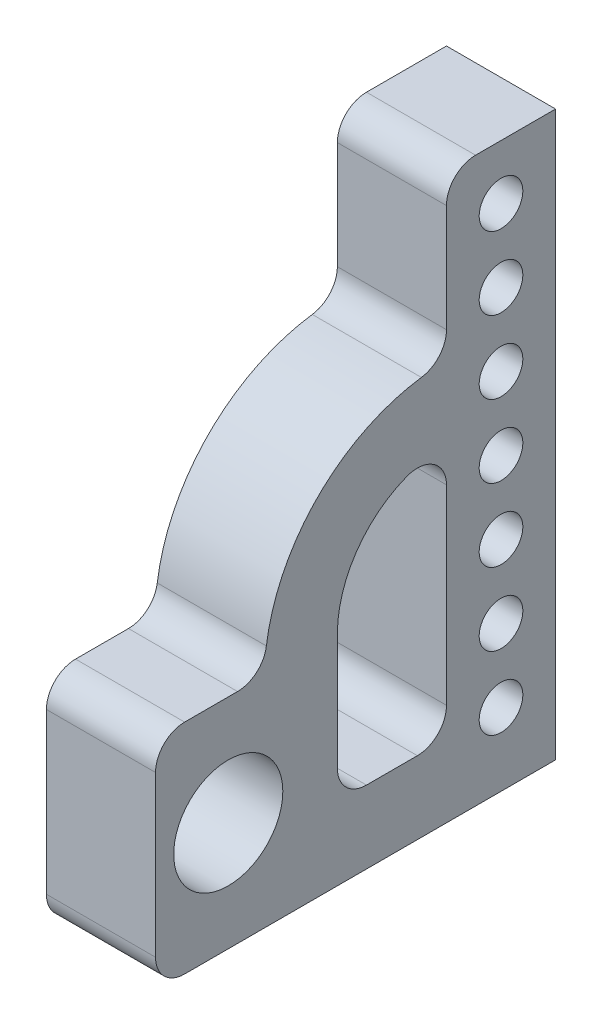
ISO-10303-21;
HEADER;
FILE_DESCRIPTION(('STEP AP214'),'2;1');
FILE_NAME('part.step','',(''),(''),'','','');
FILE_SCHEMA(('AUTOMOTIVE_DESIGN { 1 0 10303 214 1 1 1 1 }'));
ENDSEC;
DATA;
#1=APPLICATION_CONTEXT('core data for automotive mechanical design processes');
#2=APPLICATION_PROTOCOL_DEFINITION('international standard','automotive_design',2000,#1);
#3=PRODUCT_CONTEXT('',#1,'mechanical');
#4=PRODUCT('Part','Part','',(#3));
#5=PRODUCT_RELATED_PRODUCT_CATEGORY('part','',(#4));
#6=PRODUCT_DEFINITION_FORMATION('','',#4);
#7=PRODUCT_DEFINITION_CONTEXT('part definition',#1,'design');
#8=PRODUCT_DEFINITION('design','',#6,#7);
#9=PRODUCT_DEFINITION_SHAPE('','',#8);
#10=(LENGTH_UNIT() NAMED_UNIT(*) SI_UNIT(.MILLI.,.METRE.));
#11=(NAMED_UNIT(*) PLANE_ANGLE_UNIT() SI_UNIT($,.RADIAN.));
#12=(NAMED_UNIT(*) SI_UNIT($,.STERADIAN.) SOLID_ANGLE_UNIT());
#13=UNCERTAINTY_MEASURE_WITH_UNIT(LENGTH_MEASURE(1.E-05),#10,'distance_accuracy_value','');
#14=(GEOMETRIC_REPRESENTATION_CONTEXT(3) GLOBAL_UNCERTAINTY_ASSIGNED_CONTEXT((#13)) GLOBAL_UNIT_ASSIGNED_CONTEXT((#10,
#11,#12)) REPRESENTATION_CONTEXT('',''));
#15=CARTESIAN_POINT('',(0.,0.,0.));
#16=DIRECTION('',(0.,0.,1.));
#17=DIRECTION('',(1.,0.,0.));
#18=AXIS2_PLACEMENT_3D('',#15,#16,#17);
#19=CARTESIAN_POINT('',(30.,0.,0.));
#20=DIRECTION('',(1.,0.,0.));
#21=DIRECTION('',(0.,0.,-1.));
#22=AXIS2_PLACEMENT_3D('',#19,#20,#21);
#23=PLANE('',#22);
#24=DIRECTION('',(0.,0.,1.));
#25=VECTOR('',#24,1.);
#26=CARTESIAN_POINT('',(30.,20.,0.));
#27=LINE('',#26,#25);
#28=CARTESIAN_POINT('',(30.,20.,38.));
#29=VERTEX_POINT('',#28);
#30=CARTESIAN_POINT('',(30.,20.,52.));
#31=VERTEX_POINT('',#30);
#32=EDGE_CURVE('E238',#29,#31,#27,.T.);
#33=ORIENTED_EDGE('',*,*,#32,.T.);
#34=CARTESIAN_POINT('',(30.,28.,52.));
#35=DIRECTION('',(1.,0.,0.));
#36=DIRECTION('',(0.,0.,-1.));
#37=AXIS2_PLACEMENT_3D('',#34,#35,#36);
#38=CIRCLE('',#37,8.);
#39=CARTESIAN_POINT('',(30.,28.,60.));
#40=VERTEX_POINT('',#39);
#41=EDGE_CURVE('E351',#31,#40,#38,.F.);
#42=ORIENTED_EDGE('',*,*,#41,.T.);
#43=DIRECTION('',(0.,1.,0.));
#44=VECTOR('',#43,1.);
#45=CARTESIAN_POINT('',(30.,0.,60.));
#46=LINE('',#45,#44);
#47=CARTESIAN_POINT('',(30.,60.,60.));
#48=VERTEX_POINT('',#47);
#49=EDGE_CURVE('E230',#40,#48,#46,.T.);
#50=ORIENTED_EDGE('',*,*,#49,.T.);
#51=CARTESIAN_POINT('',(30.,60.,30.));
#52=DIRECTION('',(1.,0.,0.));
#53=DIRECTION('',(0.,0.,-1.));
#54=AXIS2_PLACEMENT_3D('',#51,#52,#53);
#55=CIRCLE('',#54,30.);
#56=CARTESIAN_POINT('',(30.,87.946229361708,40.9090909090909));
#57=VERTEX_POINT('',#56);
#58=EDGE_CURVE('E232',#48,#57,#55,.F.);
#59=ORIENTED_EDGE('',*,*,#58,.T.);
#60=CARTESIAN_POINT('',(30.,80.4939015319192,38.));
#61=DIRECTION('',(1.,0.,0.));
#62=DIRECTION('',(0.,0.,-1.));
#63=AXIS2_PLACEMENT_3D('',#60,#61,#62);
#64=CIRCLE('',#63,8.);
#65=CARTESIAN_POINT('',(30.,80.4939015319192,30.));
#66=VERTEX_POINT('',#65);
#67=EDGE_CURVE('E347',#57,#66,#64,.F.);
#68=ORIENTED_EDGE('',*,*,#67,.T.);
#69=DIRECTION('',(0.,-1.,0.));
#70=VECTOR('',#69,1.);
#71=CARTESIAN_POINT('',(30.,0.,30.));
#72=LINE('',#71,#70);
#73=CARTESIAN_POINT('',(30.,28.,30.));
#74=VERTEX_POINT('',#73);
#75=EDGE_CURVE('E235',#66,#74,#72,.T.);
#76=ORIENTED_EDGE('',*,*,#75,.T.);
#77=CARTESIAN_POINT('',(30.,28.,38.));
#78=DIRECTION('',(1.,0.,0.));
#79=DIRECTION('',(0.,0.,-1.));
#80=AXIS2_PLACEMENT_3D('',#77,#78,#79);
#81=CIRCLE('',#80,8.);
#82=EDGE_CURVE('E355',#74,#29,#81,.F.);
#83=ORIENTED_EDGE('',*,*,#82,.T.);
#84=EDGE_LOOP('',(#33,#42,#50,#59,#68,#76,#83));
#85=FACE_BOUND('',#84,.T.);
#86=DIRECTION('',(0.,0.,1.));
#87=VECTOR('',#86,1.);
#88=CARTESIAN_POINT('',(30.,155.,0.));
#89=LINE('',#88,#87);
#90=CARTESIAN_POINT('',(30.,155.,0.));
#91=VERTEX_POINT('',#90);
#92=CARTESIAN_POINT('',(30.,155.,22.));
#93=VERTEX_POINT('',#92);
#94=EDGE_CURVE('E217',#91,#93,#89,.T.);
#95=ORIENTED_EDGE('',*,*,#94,.T.);
#96=CARTESIAN_POINT('',(30.,147.,22.));
#97=DIRECTION('',(1.,0.,0.));
#98=DIRECTION('',(0.,0.,-1.));
#99=AXIS2_PLACEMENT_3D('',#96,#97,#98);
#100=CIRCLE('',#99,8.);
#101=CARTESIAN_POINT('',(30.,147.,30.));
#102=VERTEX_POINT('',#101);
#103=EDGE_CURVE('E326',#93,#102,#100,.T.);
#104=ORIENTED_EDGE('',*,*,#103,.T.);
#105=DIRECTION('',(0.,-1.,0.));
#106=VECTOR('',#105,1.);
#107=CARTESIAN_POINT('',(30.,0.,30.));
#108=LINE('',#107,#106);
#109=CARTESIAN_POINT('',(30.,117.44562646538,30.));
#110=VERTEX_POINT('',#109);
#111=EDGE_CURVE('E227',#102,#110,#108,.T.);
#112=ORIENTED_EDGE('',*,*,#111,.T.);
#113=CARTESIAN_POINT('',(30.,117.44562646538,38.));
#114=DIRECTION('',(1.,0.,0.));
#115=DIRECTION('',(0.,0.,-1.));
#116=AXIS2_PLACEMENT_3D('',#113,#114,#115);
#117=CIRCLE('',#116,8.);
#118=CARTESIAN_POINT('',(30.,109.5220917805,36.8965517241379));
#119=VERTEX_POINT('',#118);
#120=EDGE_CURVE('E359',#110,#119,#117,.F.);
#121=ORIENTED_EDGE('',*,*,#120,.T.);
#122=CARTESIAN_POINT('',(30.,60.,30.));
#123=DIRECTION('',(1.,0.,0.));
#124=DIRECTION('',(0.,0.,-1.));
#125=AXIS2_PLACEMENT_3D('',#122,#123,#124);
#126=CIRCLE('',#125,50.);
#127=CARTESIAN_POINT('',(30.,66.8965517241379,79.5220917805002));
#128=VERTEX_POINT('',#127);
#129=EDGE_CURVE('E377',#128,#119,#126,.F.);
#130=ORIENTED_EDGE('',*,*,#129,.F.);
#131=CARTESIAN_POINT('',(30.,68.,87.4456264653803));
#132=DIRECTION('',(1.,0.,0.));
#133=DIRECTION('',(0.,0.,-1.));
#134=AXIS2_PLACEMENT_3D('',#131,#132,#133);
#135=CIRCLE('',#134,8.);
#136=CARTESIAN_POINT('',(30.,60.,87.4456264653803));
#137=VERTEX_POINT('',#136);
#138=EDGE_CURVE('E12',#128,#137,#135,.F.);
#139=ORIENTED_EDGE('',*,*,#138,.T.);
#140=DIRECTION('',(0.,0.,-1.));
#141=VECTOR('',#140,1.);
#142=CARTESIAN_POINT('',(30.,60.,0.));
#143=LINE('',#142,#141);
#144=CARTESIAN_POINT('',(30.,60.,102.));
#145=VERTEX_POINT('',#144);
#146=EDGE_CURVE('E222',#145,#137,#143,.T.);
#147=ORIENTED_EDGE('',*,*,#146,.F.);
#148=CARTESIAN_POINT('',(30.,52.,102.));
#149=DIRECTION('',(1.,0.,0.));
#150=DIRECTION('',(0.,0.,-1.));
#151=AXIS2_PLACEMENT_3D('',#148,#149,#150);
#152=CIRCLE('',#151,8.);
#153=CARTESIAN_POINT('',(30.,52.,110.));
#154=VERTEX_POINT('',#153);
#155=EDGE_CURVE('E87',#145,#154,#152,.T.);
#156=ORIENTED_EDGE('',*,*,#155,.T.);
#157=DIRECTION('',(0.,1.,0.));
#158=VECTOR('',#157,1.);
#159=CARTESIAN_POINT('',(30.,0.,110.));
#160=LINE('',#159,#158);
#161=CARTESIAN_POINT('',(30.,8.,110.));
#162=VERTEX_POINT('',#161);
#163=EDGE_CURVE('E220',#162,#154,#160,.T.);
#164=ORIENTED_EDGE('',*,*,#163,.F.);
#165=CARTESIAN_POINT('',(30.,8.,102.));
#166=DIRECTION('',(1.,0.,0.));
#167=DIRECTION('',(0.,0.,-1.));
#168=AXIS2_PLACEMENT_3D('',#165,#166,#167);
#169=CIRCLE('',#168,8.);
#170=CARTESIAN_POINT('',(30.,0.,102.));
#171=VERTEX_POINT('',#170);
#172=EDGE_CURVE('E81',#162,#171,#169,.T.);
#173=ORIENTED_EDGE('',*,*,#172,.T.);
#174=DIRECTION('',(0.,0.,1.));
#175=VECTOR('',#174,1.);
#176=CARTESIAN_POINT('',(30.,0.,0.));
#177=LINE('',#176,#175);
#178=CARTESIAN_POINT('',(30.,0.,0.));
#179=VERTEX_POINT('',#178);
#180=EDGE_CURVE('E201',#179,#171,#177,.T.);
#181=ORIENTED_EDGE('',*,*,#180,.F.);
#182=DIRECTION('',(0.,1.,0.));
#183=VECTOR('',#182,1.);
#184=CARTESIAN_POINT('',(30.,0.,0.));
#185=LINE('',#184,#183);
#186=EDGE_CURVE('E213',#179,#91,#185,.T.);
#187=ORIENTED_EDGE('',*,*,#186,.T.);
#188=EDGE_LOOP('',(#95,#104,#112,#121,#130,#139,#147,#156,#164,#173,#181,#187));
#189=FACE_BOUND('',#188,.T.);
#190=CARTESIAN_POINT('',(30.,20.,15.));
#191=DIRECTION('',(1.,0.,0.));
#192=DIRECTION('',(0.,0.,-1.));
#193=AXIS2_PLACEMENT_3D('',#190,#191,#192);
#194=CIRCLE('',#193,6.);
#195=CARTESIAN_POINT('',(30.,20.,9.));
#196=VERTEX_POINT('',#195);
#197=EDGE_CURVE('E381',#196,#196,#194,.T.);
#198=ORIENTED_EDGE('',*,*,#197,.F.);
#199=EDGE_LOOP('',(#198));
#200=FACE_BOUND('',#199,.T.);
#201=CARTESIAN_POINT('',(30.,40.,15.));
#202=DIRECTION('',(1.,0.,0.));
#203=DIRECTION('',(0.,0.,-1.));
#204=AXIS2_PLACEMENT_3D('',#201,#202,#203);
#205=CIRCLE('',#204,6.);
#206=CARTESIAN_POINT('',(30.,40.,9.));
#207=VERTEX_POINT('',#206);
#208=EDGE_CURVE('E386',#207,#207,#205,.T.);
#209=ORIENTED_EDGE('',*,*,#208,.F.);
#210=EDGE_LOOP('',(#209));
#211=FACE_BOUND('',#210,.T.);
#212=CARTESIAN_POINT('',(30.,60.,15.));
#213=DIRECTION('',(1.,0.,0.));
#214=DIRECTION('',(0.,0.,-1.));
#215=AXIS2_PLACEMENT_3D('',#212,#213,#214);
#216=CIRCLE('',#215,6.);
#217=CARTESIAN_POINT('',(30.,60.,9.));
#218=VERTEX_POINT('',#217);
#219=EDGE_CURVE('E389',#218,#218,#216,.T.);
#220=ORIENTED_EDGE('',*,*,#219,.F.);
#221=EDGE_LOOP('',(#220));
#222=FACE_BOUND('',#221,.T.);
#223=CARTESIAN_POINT('',(30.,80.,15.));
#224=DIRECTION('',(1.,0.,0.));
#225=DIRECTION('',(0.,0.,-1.));
#226=AXIS2_PLACEMENT_3D('',#223,#224,#225);
#227=CIRCLE('',#226,6.);
#228=CARTESIAN_POINT('',(30.,80.,9.));
#229=VERTEX_POINT('',#228);
#230=EDGE_CURVE('E392',#229,#229,#227,.T.);
#231=ORIENTED_EDGE('',*,*,#230,.F.);
#232=EDGE_LOOP('',(#231));
#233=FACE_BOUND('',#232,.T.);
#234=CARTESIAN_POINT('',(30.,100.,15.));
#235=DIRECTION('',(1.,0.,0.));
#236=DIRECTION('',(0.,0.,-1.));
#237=AXIS2_PLACEMENT_3D('',#234,#235,#236);
#238=CIRCLE('',#237,6.);
#239=CARTESIAN_POINT('',(30.,100.,9.));
#240=VERTEX_POINT('',#239);
#241=EDGE_CURVE('E395',#240,#240,#238,.T.);
#242=ORIENTED_EDGE('',*,*,#241,.F.);
#243=EDGE_LOOP('',(#242));
#244=FACE_BOUND('',#243,.T.);
#245=CARTESIAN_POINT('',(30.,120.,15.));
#246=DIRECTION('',(1.,0.,0.));
#247=DIRECTION('',(0.,0.,-1.));
#248=AXIS2_PLACEMENT_3D('',#245,#246,#247);
#249=CIRCLE('',#248,6.00000000000002);
#250=CARTESIAN_POINT('',(30.,120.,8.99999999999998));
#251=VERTEX_POINT('',#250);
#252=EDGE_CURVE('E398',#251,#251,#249,.T.);
#253=ORIENTED_EDGE('',*,*,#252,.F.);
#254=EDGE_LOOP('',(#253));
#255=FACE_BOUND('',#254,.T.);
#256=CARTESIAN_POINT('',(30.,140.,15.));
#257=DIRECTION('',(1.,0.,0.));
#258=DIRECTION('',(0.,0.,-1.));
#259=AXIS2_PLACEMENT_3D('',#256,#257,#258);
#260=CIRCLE('',#259,6.00000000000002);
#261=CARTESIAN_POINT('',(30.,140.,8.99999999999998));
#262=VERTEX_POINT('',#261);
#263=EDGE_CURVE('E292',#262,#262,#260,.T.);
#264=ORIENTED_EDGE('',*,*,#263,.F.);
#265=EDGE_LOOP('',(#264));
#266=FACE_BOUND('',#265,.T.);
#267=CARTESIAN_POINT('',(30.,30.,90.));
#268=DIRECTION('',(1.,0.,0.));
#269=DIRECTION('',(0.,0.,-1.));
#270=AXIS2_PLACEMENT_3D('',#267,#268,#269);
#271=CIRCLE('',#270,15.);
#272=CARTESIAN_POINT('',(30.,30.,75.));
#273=VERTEX_POINT('',#272);
#274=EDGE_CURVE('E245',#273,#273,#271,.T.);
#275=ORIENTED_EDGE('',*,*,#274,.F.);
#276=EDGE_LOOP('',(#275));
#277=FACE_BOUND('',#276,.T.);
#278=ADVANCED_FACE('F66',(#85,#189,#200,#211,#222,#233,#244,#255,#266,#277),#23,.T.);
#279=CARTESIAN_POINT('',(0.,0.,0.));
#280=DIRECTION('',(1.,0.,0.));
#281=DIRECTION('',(0.,0.,-1.));
#282=AXIS2_PLACEMENT_3D('',#279,#280,#281);
#283=PLANE('',#282);
#284=CARTESIAN_POINT('',(0.,140.,15.));
#285=DIRECTION('',(1.,0.,0.));
#286=DIRECTION('',(0.,0.,-1.));
#287=AXIS2_PLACEMENT_3D('',#284,#285,#286);
#288=CIRCLE('',#287,6.00000000000002);
#289=CARTESIAN_POINT('',(0.,140.,8.99999999999998));
#290=VERTEX_POINT('',#289);
#291=EDGE_CURVE('E241',#290,#290,#288,.T.);
#292=ORIENTED_EDGE('',*,*,#291,.T.);
#293=EDGE_LOOP('',(#292));
#294=FACE_BOUND('',#293,.T.);
#295=CARTESIAN_POINT('',(0.,120.,15.));
#296=DIRECTION('',(1.,0.,0.));
#297=DIRECTION('',(0.,0.,-1.));
#298=AXIS2_PLACEMENT_3D('',#295,#296,#297);
#299=CIRCLE('',#298,6.00000000000002);
#300=CARTESIAN_POINT('',(0.,120.,8.99999999999998));
#301=VERTEX_POINT('',#300);
#302=EDGE_CURVE('E244',#301,#301,#299,.T.);
#303=ORIENTED_EDGE('',*,*,#302,.T.);
#304=EDGE_LOOP('',(#303));
#305=FACE_BOUND('',#304,.T.);
#306=CARTESIAN_POINT('',(0.,100.,15.));
#307=DIRECTION('',(1.,0.,0.));
#308=DIRECTION('',(0.,0.,-1.));
#309=AXIS2_PLACEMENT_3D('',#306,#307,#308);
#310=CIRCLE('',#309,6.);
#311=CARTESIAN_POINT('',(0.,100.,9.));
#312=VERTEX_POINT('',#311);
#313=EDGE_CURVE('E248',#312,#312,#310,.T.);
#314=ORIENTED_EDGE('',*,*,#313,.T.);
#315=EDGE_LOOP('',(#314));
#316=FACE_BOUND('',#315,.T.);
#317=CARTESIAN_POINT('',(0.,80.,15.));
#318=DIRECTION('',(1.,0.,0.));
#319=DIRECTION('',(0.,0.,-1.));
#320=AXIS2_PLACEMENT_3D('',#317,#318,#319);
#321=CIRCLE('',#320,6.);
#322=CARTESIAN_POINT('',(0.,80.,9.));
#323=VERTEX_POINT('',#322);
#324=EDGE_CURVE('E251',#323,#323,#321,.T.);
#325=ORIENTED_EDGE('',*,*,#324,.T.);
#326=EDGE_LOOP('',(#325));
#327=FACE_BOUND('',#326,.T.);
#328=CARTESIAN_POINT('',(0.,60.,15.));
#329=DIRECTION('',(1.,0.,0.));
#330=DIRECTION('',(0.,0.,-1.));
#331=AXIS2_PLACEMENT_3D('',#328,#329,#330);
#332=CIRCLE('',#331,6.);
#333=CARTESIAN_POINT('',(0.,60.,9.));
#334=VERTEX_POINT('',#333);
#335=EDGE_CURVE('E254',#334,#334,#332,.T.);
#336=ORIENTED_EDGE('',*,*,#335,.T.);
#337=EDGE_LOOP('',(#336));
#338=FACE_BOUND('',#337,.T.);
#339=CARTESIAN_POINT('',(0.,40.,15.));
#340=DIRECTION('',(1.,0.,0.));
#341=DIRECTION('',(0.,0.,-1.));
#342=AXIS2_PLACEMENT_3D('',#339,#340,#341);
#343=CIRCLE('',#342,6.);
#344=CARTESIAN_POINT('',(0.,40.,9.));
#345=VERTEX_POINT('',#344);
#346=EDGE_CURVE('E257',#345,#345,#343,.T.);
#347=ORIENTED_EDGE('',*,*,#346,.T.);
#348=EDGE_LOOP('',(#347));
#349=FACE_BOUND('',#348,.T.);
#350=CARTESIAN_POINT('',(0.,20.,15.));
#351=DIRECTION('',(1.,0.,0.));
#352=DIRECTION('',(0.,0.,-1.));
#353=AXIS2_PLACEMENT_3D('',#350,#351,#352);
#354=CIRCLE('',#353,6.);
#355=CARTESIAN_POINT('',(0.,20.,9.));
#356=VERTEX_POINT('',#355);
#357=EDGE_CURVE('E260',#356,#356,#354,.T.);
#358=ORIENTED_EDGE('',*,*,#357,.T.);
#359=EDGE_LOOP('',(#358));
#360=FACE_BOUND('',#359,.T.);
#361=DIRECTION('',(0.,-1.,0.));
#362=VECTOR('',#361,1.);
#363=CARTESIAN_POINT('',(0.,0.,30.));
#364=LINE('',#363,#362);
#365=CARTESIAN_POINT('',(0.,147.,30.));
#366=VERTEX_POINT('',#365);
#367=CARTESIAN_POINT('',(0.,117.44562646538,30.));
#368=VERTEX_POINT('',#367);
#369=EDGE_CURVE('E278',#366,#368,#364,.T.);
#370=ORIENTED_EDGE('',*,*,#369,.F.);
#371=CARTESIAN_POINT('',(0.,147.,22.));
#372=DIRECTION('',(1.,0.,0.));
#373=DIRECTION('',(0.,0.,-1.));
#374=AXIS2_PLACEMENT_3D('',#371,#372,#373);
#375=CIRCLE('',#374,8.);
#376=CARTESIAN_POINT('',(0.,155.,22.));
#377=VERTEX_POINT('',#376);
#378=EDGE_CURVE('E320',#366,#377,#375,.F.);
#379=ORIENTED_EDGE('',*,*,#378,.T.);
#380=DIRECTION('',(0.,0.,1.));
#381=VECTOR('',#380,1.);
#382=CARTESIAN_POINT('',(0.,155.,0.));
#383=LINE('',#382,#381);
#384=CARTESIAN_POINT('',(0.,155.,0.));
#385=VERTEX_POINT('',#384);
#386=EDGE_CURVE('E275',#385,#377,#383,.T.);
#387=ORIENTED_EDGE('',*,*,#386,.F.);
#388=DIRECTION('',(0.,1.,0.));
#389=VECTOR('',#388,1.);
#390=CARTESIAN_POINT('',(0.,0.,0.));
#391=LINE('',#390,#389);
#392=CARTESIAN_POINT('',(0.,0.,0.));
#393=VERTEX_POINT('',#392);
#394=EDGE_CURVE('E273',#393,#385,#391,.T.);
#395=ORIENTED_EDGE('',*,*,#394,.F.);
#396=DIRECTION('',(0.,0.,1.));
#397=VECTOR('',#396,1.);
#398=CARTESIAN_POINT('',(0.,0.,0.));
#399=LINE('',#398,#397);
#400=CARTESIAN_POINT('',(0.,0.,102.));
#401=VERTEX_POINT('',#400);
#402=EDGE_CURVE('E204',#393,#401,#399,.T.);
#403=ORIENTED_EDGE('',*,*,#402,.T.);
#404=CARTESIAN_POINT('',(0.,8.,102.));
#405=DIRECTION('',(1.,0.,0.));
#406=DIRECTION('',(0.,0.,-1.));
#407=AXIS2_PLACEMENT_3D('',#404,#405,#406);
#408=CIRCLE('',#407,8.);
#409=CARTESIAN_POINT('',(0.,8.,110.));
#410=VERTEX_POINT('',#409);
#411=EDGE_CURVE('E318',#401,#410,#408,.F.);
#412=ORIENTED_EDGE('',*,*,#411,.T.);
#413=DIRECTION('',(0.,1.,0.));
#414=VECTOR('',#413,1.);
#415=CARTESIAN_POINT('',(0.,0.,110.));
#416=LINE('',#415,#414);
#417=CARTESIAN_POINT('',(0.,52.,110.));
#418=VERTEX_POINT('',#417);
#419=EDGE_CURVE('E269',#410,#418,#416,.T.);
#420=ORIENTED_EDGE('',*,*,#419,.T.);
#421=CARTESIAN_POINT('',(0.,52.,102.));
#422=DIRECTION('',(1.,0.,0.));
#423=DIRECTION('',(0.,0.,-1.));
#424=AXIS2_PLACEMENT_3D('',#421,#422,#423);
#425=CIRCLE('',#424,8.);
#426=CARTESIAN_POINT('',(0.,60.,102.));
#427=VERTEX_POINT('',#426);
#428=EDGE_CURVE('E316',#418,#427,#425,.F.);
#429=ORIENTED_EDGE('',*,*,#428,.T.);
#430=DIRECTION('',(0.,0.,-1.));
#431=VECTOR('',#430,1.);
#432=CARTESIAN_POINT('',(0.,60.,0.));
#433=LINE('',#432,#431);
#434=CARTESIAN_POINT('',(0.,60.,87.4456264653803));
#435=VERTEX_POINT('',#434);
#436=EDGE_CURVE('E266',#427,#435,#433,.T.);
#437=ORIENTED_EDGE('',*,*,#436,.T.);
#438=CARTESIAN_POINT('',(0.,68.,87.4456264653803));
#439=DIRECTION('',(1.,0.,0.));
#440=DIRECTION('',(0.,0.,-1.));
#441=AXIS2_PLACEMENT_3D('',#438,#439,#440);
#442=CIRCLE('',#441,8.);
#443=CARTESIAN_POINT('',(0.,66.8965517241379,79.5220917805002));
#444=VERTEX_POINT('',#443);
#445=EDGE_CURVE('E74',#435,#444,#442,.T.);
#446=ORIENTED_EDGE('',*,*,#445,.T.);
#447=CARTESIAN_POINT('',(0.,60.,30.));
#448=DIRECTION('',(1.,0.,0.));
#449=DIRECTION('',(0.,0.,-1.));
#450=AXIS2_PLACEMENT_3D('',#447,#448,#449);
#451=CIRCLE('',#450,50.);
#452=CARTESIAN_POINT('',(0.,109.5220917805,36.8965517241379));
#453=VERTEX_POINT('',#452);
#454=EDGE_CURVE('E263',#444,#453,#451,.F.);
#455=ORIENTED_EDGE('',*,*,#454,.T.);
#456=CARTESIAN_POINT('',(0.,117.44562646538,38.));
#457=DIRECTION('',(1.,0.,0.));
#458=DIRECTION('',(0.,0.,-1.));
#459=AXIS2_PLACEMENT_3D('',#456,#457,#458);
#460=CIRCLE('',#459,8.);
#461=EDGE_CURVE('E357',#453,#368,#460,.T.);
#462=ORIENTED_EDGE('',*,*,#461,.T.);
#463=EDGE_LOOP('',(#370,#379,#387,#395,#403,#412,#420,#429,#437,#446,#455,#462));
#464=FACE_BOUND('',#463,.T.);
#465=DIRECTION('',(0.,1.,0.));
#466=VECTOR('',#465,1.);
#467=CARTESIAN_POINT('',(0.,0.,60.));
#468=LINE('',#467,#466);
#469=CARTESIAN_POINT('',(0.,28.,60.));
#470=VERTEX_POINT('',#469);
#471=CARTESIAN_POINT('',(0.,60.,60.));
#472=VERTEX_POINT('',#471);
#473=EDGE_CURVE('E281',#470,#472,#468,.T.);
#474=ORIENTED_EDGE('',*,*,#473,.F.);
#475=CARTESIAN_POINT('',(0.,28.,52.));
#476=DIRECTION('',(1.,0.,0.));
#477=DIRECTION('',(0.,0.,-1.));
#478=AXIS2_PLACEMENT_3D('',#475,#476,#477);
#479=CIRCLE('',#478,8.);
#480=CARTESIAN_POINT('',(0.,20.,52.));
#481=VERTEX_POINT('',#480);
#482=EDGE_CURVE('E349',#470,#481,#479,.T.);
#483=ORIENTED_EDGE('',*,*,#482,.T.);
#484=DIRECTION('',(0.,0.,1.));
#485=VECTOR('',#484,1.);
#486=CARTESIAN_POINT('',(0.,20.,0.));
#487=LINE('',#486,#485);
#488=CARTESIAN_POINT('',(0.,20.,38.));
#489=VERTEX_POINT('',#488);
#490=EDGE_CURVE('E289',#489,#481,#487,.T.);
#491=ORIENTED_EDGE('',*,*,#490,.F.);
#492=CARTESIAN_POINT('',(0.,28.,38.));
#493=DIRECTION('',(1.,0.,0.));
#494=DIRECTION('',(0.,0.,-1.));
#495=AXIS2_PLACEMENT_3D('',#492,#493,#494);
#496=CIRCLE('',#495,8.);
#497=CARTESIAN_POINT('',(0.,28.,30.));
#498=VERTEX_POINT('',#497);
#499=EDGE_CURVE('E353',#489,#498,#496,.T.);
#500=ORIENTED_EDGE('',*,*,#499,.T.);
#501=DIRECTION('',(0.,-1.,0.));
#502=VECTOR('',#501,1.);
#503=CARTESIAN_POINT('',(0.,0.,30.));
#504=LINE('',#503,#502);
#505=CARTESIAN_POINT('',(0.,80.4939015319192,30.));
#506=VERTEX_POINT('',#505);
#507=EDGE_CURVE('E286',#506,#498,#504,.T.);
#508=ORIENTED_EDGE('',*,*,#507,.F.);
#509=CARTESIAN_POINT('',(0.,80.4939015319192,38.));
#510=DIRECTION('',(1.,0.,0.));
#511=DIRECTION('',(0.,0.,-1.));
#512=AXIS2_PLACEMENT_3D('',#509,#510,#511);
#513=CIRCLE('',#512,8.);
#514=CARTESIAN_POINT('',(0.,87.946229361708,40.9090909090909));
#515=VERTEX_POINT('',#514);
#516=EDGE_CURVE('E345',#506,#515,#513,.T.);
#517=ORIENTED_EDGE('',*,*,#516,.T.);
#518=CARTESIAN_POINT('',(0.,60.,30.));
#519=DIRECTION('',(1.,0.,0.));
#520=DIRECTION('',(0.,0.,-1.));
#521=AXIS2_PLACEMENT_3D('',#518,#519,#520);
#522=CIRCLE('',#521,30.);
#523=EDGE_CURVE('E283',#472,#515,#522,.F.);
#524=ORIENTED_EDGE('',*,*,#523,.F.);
#525=EDGE_LOOP('',(#474,#483,#491,#500,#508,#517,#524));
#526=FACE_BOUND('',#525,.T.);
#527=CARTESIAN_POINT('',(0.,30.,90.));
#528=DIRECTION('',(1.,0.,0.));
#529=DIRECTION('',(0.,0.,-1.));
#530=AXIS2_PLACEMENT_3D('',#527,#528,#529);
#531=CIRCLE('',#530,15.);
#532=CARTESIAN_POINT('',(0.,30.,75.));
#533=VERTEX_POINT('',#532);
#534=EDGE_CURVE('E403',#533,#533,#531,.T.);
#535=ORIENTED_EDGE('',*,*,#534,.T.);
#536=EDGE_LOOP('',(#535));
#537=FACE_BOUND('',#536,.T.);
#538=ADVANCED_FACE('F363',(#294,#305,#316,#327,#338,#349,#360,#464,#526,#537),#283,.F.);
#539=CARTESIAN_POINT('',(30.,0.,60.));
#540=DIRECTION('',(0.,0.,1.));
#541=DIRECTION('',(0.,-1.,0.));
#542=AXIS2_PLACEMENT_3D('',#539,#540,#541);
#543=PLANE('',#542);
#544=ORIENTED_EDGE('',*,*,#49,.F.);
#545=DIRECTION('',(-1.,0.,0.));
#546=VECTOR('',#545,1.);
#547=CARTESIAN_POINT('',(0.,28.,60.));
#548=LINE('',#547,#546);
#549=EDGE_CURVE('E303',#40,#470,#548,.T.);
#550=ORIENTED_EDGE('',*,*,#549,.T.);
#551=ORIENTED_EDGE('',*,*,#473,.T.);
#552=DIRECTION('',(-1.,0.,0.));
#553=VECTOR('',#552,1.);
#554=CARTESIAN_POINT('',(30.,60.,60.));
#555=LINE('',#554,#553);
#556=EDGE_CURVE('E208',#48,#472,#555,.T.);
#557=ORIENTED_EDGE('',*,*,#556,.F.);
#558=EDGE_LOOP('',(#544,#550,#551,#557));
#559=FACE_BOUND('',#558,.T.);
#560=ADVANCED_FACE('F419',(#559),#543,.F.);
#561=CARTESIAN_POINT('',(30.,60.,30.));
#562=DIRECTION('',(-1.,0.,0.));
#563=DIRECTION('',(0.,0.,1.));
#564=AXIS2_PLACEMENT_3D('',#561,#562,#563);
#565=CYLINDRICAL_SURFACE('',#564,30.);
#566=ORIENTED_EDGE('',*,*,#523,.T.);
#567=DIRECTION('',(-1.,0.,0.));
#568=VECTOR('',#567,1.);
#569=CARTESIAN_POINT('',(30.,87.946229361708,40.9090909090909));
#570=LINE('',#569,#568);
#571=EDGE_CURVE('E301',#515,#57,#570,.F.);
#572=ORIENTED_EDGE('',*,*,#571,.T.);
#573=ORIENTED_EDGE('',*,*,#58,.F.);
#574=ORIENTED_EDGE('',*,*,#556,.T.);
#575=EDGE_LOOP('',(#566,#572,#573,#574));
#576=FACE_BOUND('',#575,.T.);
#577=ADVANCED_FACE('F432',(#576),#565,.F.);
#578=CARTESIAN_POINT('',(30.,0.,30.));
#579=DIRECTION('',(0.,0.,-1.));
#580=DIRECTION('',(-1.,0.,0.));
#581=AXIS2_PLACEMENT_3D('',#578,#579,#580);
#582=PLANE('',#581);
#583=ORIENTED_EDGE('',*,*,#75,.F.);
#584=DIRECTION('',(1.,0.,0.));
#585=VECTOR('',#584,1.);
#586=CARTESIAN_POINT('',(0.,80.4939015319192,30.));
#587=LINE('',#586,#585);
#588=EDGE_CURVE('E298',#66,#506,#587,.F.);
#589=ORIENTED_EDGE('',*,*,#588,.T.);
#590=ORIENTED_EDGE('',*,*,#507,.T.);
#591=DIRECTION('',(-1.,0.,0.));
#592=VECTOR('',#591,1.);
#593=CARTESIAN_POINT('',(30.,28.,30.));
#594=LINE('',#593,#592);
#595=EDGE_CURVE('E295',#498,#74,#594,.F.);
#596=ORIENTED_EDGE('',*,*,#595,.T.);
#597=EDGE_LOOP('',(#583,#589,#590,#596));
#598=FACE_BOUND('',#597,.T.);
#599=ADVANCED_FACE('F429',(#598),#582,.F.);
#600=CARTESIAN_POINT('',(30.,60.,30.));
#601=DIRECTION('',(-1.,0.,0.));
#602=DIRECTION('',(0.,0.,1.));
#603=AXIS2_PLACEMENT_3D('',#600,#601,#602);
#604=CYLINDRICAL_SURFACE('',#603,50.);
#605=ORIENTED_EDGE('',*,*,#129,.T.);
#606=DIRECTION('',(-1.,0.,0.));
#607=VECTOR('',#606,1.);
#608=CARTESIAN_POINT('',(30.,109.5220917805,36.8965517241379));
#609=LINE('',#608,#607);
#610=EDGE_CURVE('E330',#119,#453,#609,.T.);
#611=ORIENTED_EDGE('',*,*,#610,.T.);
#612=ORIENTED_EDGE('',*,*,#454,.F.);
#613=DIRECTION('',(-1.,0.,0.));
#614=VECTOR('',#613,1.);
#615=CARTESIAN_POINT('',(30.,66.8965517241379,79.5220917805002));
#616=LINE('',#615,#614);
#617=EDGE_CURVE('E328',#444,#128,#616,.F.);
#618=ORIENTED_EDGE('',*,*,#617,.T.);
#619=EDGE_LOOP('',(#605,#611,#612,#618));
#620=FACE_BOUND('',#619,.T.);
#621=ADVANCED_FACE('F371',(#620),#604,.T.);
#622=CARTESIAN_POINT('',(30.,60.,0.));
#623=DIRECTION('',(0.,1.,0.));
#624=DIRECTION('',(0.,0.,1.));
#625=AXIS2_PLACEMENT_3D('',#622,#623,#624);
#626=PLANE('',#625);
#627=ORIENTED_EDGE('',*,*,#146,.T.);
#628=DIRECTION('',(1.,0.,0.));
#629=VECTOR('',#628,1.);
#630=CARTESIAN_POINT('',(0.,60.,87.4456264653803));
#631=LINE('',#630,#629);
#632=EDGE_CURVE('E335',#137,#435,#631,.F.);
#633=ORIENTED_EDGE('',*,*,#632,.T.);
#634=ORIENTED_EDGE('',*,*,#436,.F.);
#635=DIRECTION('',(-1.,0.,0.));
#636=VECTOR('',#635,1.);
#637=CARTESIAN_POINT('',(30.,60.,102.));
#638=LINE('',#637,#636);
#639=EDGE_CURVE('E333',#427,#145,#638,.F.);
#640=ORIENTED_EDGE('',*,*,#639,.T.);
#641=EDGE_LOOP('',(#627,#633,#634,#640));
#642=FACE_BOUND('',#641,.T.);
#643=ADVANCED_FACE('F379',(#642),#626,.T.);
#644=CARTESIAN_POINT('',(30.,0.,110.));
#645=DIRECTION('',(0.,0.,1.));
#646=DIRECTION('',(1.,0.,0.));
#647=AXIS2_PLACEMENT_3D('',#644,#645,#646);
#648=PLANE('',#647);
#649=ORIENTED_EDGE('',*,*,#419,.F.);
#650=DIRECTION('',(-1.,0.,0.));
#651=VECTOR('',#650,1.);
#652=CARTESIAN_POINT('',(30.,8.,110.));
#653=LINE('',#652,#651);
#654=EDGE_CURVE('E343',#410,#162,#653,.F.);
#655=ORIENTED_EDGE('',*,*,#654,.T.);
#656=ORIENTED_EDGE('',*,*,#163,.T.);
#657=DIRECTION('',(-1.,0.,0.));
#658=VECTOR('',#657,1.);
#659=CARTESIAN_POINT('',(30.,52.,110.));
#660=LINE('',#659,#658);
#661=EDGE_CURVE('E340',#154,#418,#660,.T.);
#662=ORIENTED_EDGE('',*,*,#661,.T.);
#663=EDGE_LOOP('',(#649,#655,#656,#662));
#664=FACE_BOUND('',#663,.T.);
#665=ADVANCED_FACE('F453',(#664),#648,.T.);
#666=CARTESIAN_POINT('',(30.,0.,0.));
#667=DIRECTION('',(0.,-1.,0.));
#668=DIRECTION('',(0.,0.,-1.));
#669=AXIS2_PLACEMENT_3D('',#666,#667,#668);
#670=PLANE('',#669);
#671=ORIENTED_EDGE('',*,*,#180,.T.);
#672=DIRECTION('',(-1.,0.,0.));
#673=VECTOR('',#672,1.);
#674=CARTESIAN_POINT('',(30.,0.,102.));
#675=LINE('',#674,#673);
#676=EDGE_CURVE('E338',#171,#401,#675,.T.);
#677=ORIENTED_EDGE('',*,*,#676,.T.);
#678=ORIENTED_EDGE('',*,*,#402,.F.);
#679=DIRECTION('',(-1.,0.,0.));
#680=VECTOR('',#679,1.);
#681=CARTESIAN_POINT('',(30.,0.,0.));
#682=LINE('',#681,#680);
#683=EDGE_CURVE('E197',#179,#393,#682,.T.);
#684=ORIENTED_EDGE('',*,*,#683,.F.);
#685=EDGE_LOOP('',(#671,#677,#678,#684));
#686=FACE_BOUND('',#685,.T.);
#687=ADVANCED_FACE('F199',(#686),#670,.T.);
#688=CARTESIAN_POINT('',(30.,0.,0.));
#689=DIRECTION('',(0.,0.,1.));
#690=DIRECTION('',(1.,0.,0.));
#691=AXIS2_PLACEMENT_3D('',#688,#689,#690);
#692=PLANE('',#691);
#693=ORIENTED_EDGE('',*,*,#394,.T.);
#694=DIRECTION('',(-1.,0.,0.));
#695=VECTOR('',#694,1.);
#696=CARTESIAN_POINT('',(30.,155.,0.));
#697=LINE('',#696,#695);
#698=EDGE_CURVE('E209',#91,#385,#697,.T.);
#699=ORIENTED_EDGE('',*,*,#698,.F.);
#700=ORIENTED_EDGE('',*,*,#186,.F.);
#701=ORIENTED_EDGE('',*,*,#683,.T.);
#702=EDGE_LOOP('',(#693,#699,#700,#701));
#703=FACE_BOUND('',#702,.T.);
#704=ADVANCED_FACE('F214',(#703),#692,.F.);
#705=CARTESIAN_POINT('',(30.,155.,0.));
#706=DIRECTION('',(0.,-1.,0.));
#707=DIRECTION('',(0.,0.,-1.));
#708=AXIS2_PLACEMENT_3D('',#705,#706,#707);
#709=PLANE('',#708);
#710=ORIENTED_EDGE('',*,*,#386,.T.);
#711=DIRECTION('',(-1.,0.,0.));
#712=VECTOR('',#711,1.);
#713=CARTESIAN_POINT('',(30.,155.,22.));
#714=LINE('',#713,#712);
#715=EDGE_CURVE('E322',#377,#93,#714,.F.);
#716=ORIENTED_EDGE('',*,*,#715,.T.);
#717=ORIENTED_EDGE('',*,*,#94,.F.);
#718=ORIENTED_EDGE('',*,*,#698,.T.);
#719=EDGE_LOOP('',(#710,#716,#717,#718));
#720=FACE_BOUND('',#719,.T.);
#721=ADVANCED_FACE('F444',(#720),#709,.F.);
#722=CARTESIAN_POINT('',(30.,0.,30.));
#723=DIRECTION('',(0.,0.,-1.));
#724=DIRECTION('',(0.,1.,0.));
#725=AXIS2_PLACEMENT_3D('',#722,#723,#724);
#726=PLANE('',#725);
#727=ORIENTED_EDGE('',*,*,#111,.F.);
#728=DIRECTION('',(-1.,0.,0.));
#729=VECTOR('',#728,1.);
#730=CARTESIAN_POINT('',(30.,147.,30.));
#731=LINE('',#730,#729);
#732=EDGE_CURVE('E313',#102,#366,#731,.T.);
#733=ORIENTED_EDGE('',*,*,#732,.T.);
#734=ORIENTED_EDGE('',*,*,#369,.T.);
#735=DIRECTION('',(-1.,0.,0.));
#736=VECTOR('',#735,1.);
#737=CARTESIAN_POINT('',(30.,117.44562646538,30.));
#738=LINE('',#737,#736);
#739=EDGE_CURVE('E311',#368,#110,#738,.F.);
#740=ORIENTED_EDGE('',*,*,#739,.T.);
#741=EDGE_LOOP('',(#727,#733,#734,#740));
#742=FACE_BOUND('',#741,.T.);
#743=ADVANCED_FACE('F440',(#742),#726,.F.);
#744=CARTESIAN_POINT('',(30.,20.,15.));
#745=DIRECTION('',(-1.,0.,0.));
#746=DIRECTION('',(0.,0.,1.));
#747=AXIS2_PLACEMENT_3D('',#744,#745,#746);
#748=CYLINDRICAL_SURFACE('',#747,6.);
#749=ORIENTED_EDGE('',*,*,#197,.T.);
#750=EDGE_LOOP('',(#749));
#751=FACE_BOUND('',#750,.T.);
#752=ORIENTED_EDGE('',*,*,#357,.F.);
#753=EDGE_LOOP('',(#752));
#754=FACE_BOUND('',#753,.T.);
#755=ADVANCED_FACE('F443',(#751,#754),#748,.F.);
#756=CARTESIAN_POINT('',(30.,40.,15.));
#757=DIRECTION('',(-1.,0.,0.));
#758=DIRECTION('',(0.,0.,1.));
#759=AXIS2_PLACEMENT_3D('',#756,#757,#758);
#760=CYLINDRICAL_SURFACE('',#759,6.);
#761=ORIENTED_EDGE('',*,*,#208,.T.);
#762=EDGE_LOOP('',(#761));
#763=FACE_BOUND('',#762,.T.);
#764=ORIENTED_EDGE('',*,*,#346,.F.);
#765=EDGE_LOOP('',(#764));
#766=FACE_BOUND('',#765,.T.);
#767=ADVANCED_FACE('F463',(#763,#766),#760,.F.);
#768=CARTESIAN_POINT('',(30.,60.,15.));
#769=DIRECTION('',(-1.,0.,0.));
#770=DIRECTION('',(0.,0.,1.));
#771=AXIS2_PLACEMENT_3D('',#768,#769,#770);
#772=CYLINDRICAL_SURFACE('',#771,6.);
#773=ORIENTED_EDGE('',*,*,#219,.T.);
#774=EDGE_LOOP('',(#773));
#775=FACE_BOUND('',#774,.T.);
#776=ORIENTED_EDGE('',*,*,#335,.F.);
#777=EDGE_LOOP('',(#776));
#778=FACE_BOUND('',#777,.T.);
#779=ADVANCED_FACE('F467',(#775,#778),#772,.F.);
#780=CARTESIAN_POINT('',(30.,80.,15.));
#781=DIRECTION('',(-1.,0.,0.));
#782=DIRECTION('',(0.,0.,1.));
#783=AXIS2_PLACEMENT_3D('',#780,#781,#782);
#784=CYLINDRICAL_SURFACE('',#783,6.);
#785=ORIENTED_EDGE('',*,*,#230,.T.);
#786=EDGE_LOOP('',(#785));
#787=FACE_BOUND('',#786,.T.);
#788=ORIENTED_EDGE('',*,*,#324,.F.);
#789=EDGE_LOOP('',(#788));
#790=FACE_BOUND('',#789,.T.);
#791=ADVANCED_FACE('F471',(#787,#790),#784,.F.);
#792=CARTESIAN_POINT('',(30.,100.,15.));
#793=DIRECTION('',(-1.,0.,0.));
#794=DIRECTION('',(0.,0.,1.));
#795=AXIS2_PLACEMENT_3D('',#792,#793,#794);
#796=CYLINDRICAL_SURFACE('',#795,6.);
#797=ORIENTED_EDGE('',*,*,#241,.T.);
#798=EDGE_LOOP('',(#797));
#799=FACE_BOUND('',#798,.T.);
#800=ORIENTED_EDGE('',*,*,#313,.F.);
#801=EDGE_LOOP('',(#800));
#802=FACE_BOUND('',#801,.T.);
#803=ADVANCED_FACE('F475',(#799,#802),#796,.F.);
#804=CARTESIAN_POINT('',(30.,120.,15.));
#805=DIRECTION('',(-1.,0.,0.));
#806=DIRECTION('',(0.,0.,1.));
#807=AXIS2_PLACEMENT_3D('',#804,#805,#806);
#808=CYLINDRICAL_SURFACE('',#807,6.00000000000002);
#809=ORIENTED_EDGE('',*,*,#252,.T.);
#810=EDGE_LOOP('',(#809));
#811=FACE_BOUND('',#810,.T.);
#812=ORIENTED_EDGE('',*,*,#302,.F.);
#813=EDGE_LOOP('',(#812));
#814=FACE_BOUND('',#813,.T.);
#815=ADVANCED_FACE('F479',(#811,#814),#808,.F.);
#816=CARTESIAN_POINT('',(30.,140.,15.));
#817=DIRECTION('',(-1.,0.,0.));
#818=DIRECTION('',(0.,0.,1.));
#819=AXIS2_PLACEMENT_3D('',#816,#817,#818);
#820=CYLINDRICAL_SURFACE('',#819,6.00000000000002);
#821=ORIENTED_EDGE('',*,*,#263,.T.);
#822=EDGE_LOOP('',(#821));
#823=FACE_BOUND('',#822,.T.);
#824=ORIENTED_EDGE('',*,*,#291,.F.);
#825=EDGE_LOOP('',(#824));
#826=FACE_BOUND('',#825,.T.);
#827=ADVANCED_FACE('F427',(#823,#826),#820,.F.);
#828=CARTESIAN_POINT('',(30.,20.,0.));
#829=DIRECTION('',(0.,-1.,0.));
#830=DIRECTION('',(0.,0.,-1.));
#831=AXIS2_PLACEMENT_3D('',#828,#829,#830);
#832=PLANE('',#831);
#833=ORIENTED_EDGE('',*,*,#490,.T.);
#834=DIRECTION('',(-1.,0.,0.));
#835=VECTOR('',#834,1.);
#836=CARTESIAN_POINT('',(30.,20.,52.));
#837=LINE('',#836,#835);
#838=EDGE_CURVE('E309',#481,#31,#837,.F.);
#839=ORIENTED_EDGE('',*,*,#838,.T.);
#840=ORIENTED_EDGE('',*,*,#32,.F.);
#841=DIRECTION('',(-1.,0.,0.));
#842=VECTOR('',#841,1.);
#843=CARTESIAN_POINT('',(0.,20.,38.));
#844=LINE('',#843,#842);
#845=EDGE_CURVE('E306',#29,#489,#844,.T.);
#846=ORIENTED_EDGE('',*,*,#845,.T.);
#847=EDGE_LOOP('',(#833,#839,#840,#846));
#848=FACE_BOUND('',#847,.T.);
#849=ADVANCED_FACE('F424',(#848),#832,.F.);
#850=CARTESIAN_POINT('',(30.,30.,90.));
#851=DIRECTION('',(-1.,0.,0.));
#852=DIRECTION('',(0.,0.,1.));
#853=AXIS2_PLACEMENT_3D('',#850,#851,#852);
#854=CYLINDRICAL_SURFACE('',#853,15.);
#855=ORIENTED_EDGE('',*,*,#274,.T.);
#856=EDGE_LOOP('',(#855));
#857=FACE_BOUND('',#856,.T.);
#858=ORIENTED_EDGE('',*,*,#534,.F.);
#859=EDGE_LOOP('',(#858));
#860=FACE_BOUND('',#859,.T.);
#861=ADVANCED_FACE('F409',(#857,#860),#854,.F.);
#862=CARTESIAN_POINT('',(30.,80.4939015319192,38.));
#863=DIRECTION('',(-1.,0.,0.));
#864=DIRECTION('',(0.,0.,1.));
#865=AXIS2_PLACEMENT_3D('',#862,#863,#864);
#866=CYLINDRICAL_SURFACE('',#865,8.);
#867=ORIENTED_EDGE('',*,*,#67,.F.);
#868=ORIENTED_EDGE('',*,*,#571,.F.);
#869=ORIENTED_EDGE('',*,*,#516,.F.);
#870=ORIENTED_EDGE('',*,*,#588,.F.);
#871=EDGE_LOOP('',(#867,#868,#869,#870));
#872=FACE_BOUND('',#871,.T.);
#873=ADVANCED_FACE('F487',(#872),#866,.F.);
#874=CARTESIAN_POINT('',(30.,28.,52.));
#875=DIRECTION('',(1.,0.,0.));
#876=DIRECTION('',(0.,0.,-1.));
#877=AXIS2_PLACEMENT_3D('',#874,#875,#876);
#878=CYLINDRICAL_SURFACE('',#877,8.);
#879=ORIENTED_EDGE('',*,*,#41,.F.);
#880=ORIENTED_EDGE('',*,*,#838,.F.);
#881=ORIENTED_EDGE('',*,*,#482,.F.);
#882=ORIENTED_EDGE('',*,*,#549,.F.);
#883=EDGE_LOOP('',(#879,#880,#881,#882));
#884=FACE_BOUND('',#883,.T.);
#885=ADVANCED_FACE('F490',(#884),#878,.F.);
#886=CARTESIAN_POINT('',(30.,28.,38.));
#887=DIRECTION('',(1.,0.,0.));
#888=DIRECTION('',(0.,0.,-1.));
#889=AXIS2_PLACEMENT_3D('',#886,#887,#888);
#890=CYLINDRICAL_SURFACE('',#889,8.);
#891=ORIENTED_EDGE('',*,*,#82,.F.);
#892=ORIENTED_EDGE('',*,*,#595,.F.);
#893=ORIENTED_EDGE('',*,*,#499,.F.);
#894=ORIENTED_EDGE('',*,*,#845,.F.);
#895=EDGE_LOOP('',(#891,#892,#893,#894));
#896=FACE_BOUND('',#895,.T.);
#897=ADVANCED_FACE('F494',(#896),#890,.F.);
#898=CARTESIAN_POINT('',(30.,147.,22.));
#899=DIRECTION('',(-1.,0.,0.));
#900=DIRECTION('',(0.,0.,1.));
#901=AXIS2_PLACEMENT_3D('',#898,#899,#900);
#902=CYLINDRICAL_SURFACE('',#901,8.);
#903=ORIENTED_EDGE('',*,*,#103,.F.);
#904=ORIENTED_EDGE('',*,*,#715,.F.);
#905=ORIENTED_EDGE('',*,*,#378,.F.);
#906=ORIENTED_EDGE('',*,*,#732,.F.);
#907=EDGE_LOOP('',(#903,#904,#905,#906));
#908=FACE_BOUND('',#907,.T.);
#909=ADVANCED_FACE('F498',(#908),#902,.T.);
#910=CARTESIAN_POINT('',(30.,117.44562646538,38.));
#911=DIRECTION('',(-1.,0.,0.));
#912=DIRECTION('',(0.,0.,1.));
#913=AXIS2_PLACEMENT_3D('',#910,#911,#912);
#914=CYLINDRICAL_SURFACE('',#913,8.);
#915=ORIENTED_EDGE('',*,*,#120,.F.);
#916=ORIENTED_EDGE('',*,*,#739,.F.);
#917=ORIENTED_EDGE('',*,*,#461,.F.);
#918=ORIENTED_EDGE('',*,*,#610,.F.);
#919=EDGE_LOOP('',(#915,#916,#917,#918));
#920=FACE_BOUND('',#919,.T.);
#921=ADVANCED_FACE('F502',(#920),#914,.F.);
#922=CARTESIAN_POINT('',(30.,68.,87.4456264653803));
#923=DIRECTION('',(-1.,0.,0.));
#924=DIRECTION('',(0.,0.,1.));
#925=AXIS2_PLACEMENT_3D('',#922,#923,#924);
#926=CYLINDRICAL_SURFACE('',#925,8.);
#927=ORIENTED_EDGE('',*,*,#138,.F.);
#928=ORIENTED_EDGE('',*,*,#617,.F.);
#929=ORIENTED_EDGE('',*,*,#445,.F.);
#930=ORIENTED_EDGE('',*,*,#632,.F.);
#931=EDGE_LOOP('',(#927,#928,#929,#930));
#932=FACE_BOUND('',#931,.T.);
#933=ADVANCED_FACE('F375',(#932),#926,.F.);
#934=CARTESIAN_POINT('',(30.,8.,102.));
#935=DIRECTION('',(-1.,0.,0.));
#936=DIRECTION('',(0.,0.,1.));
#937=AXIS2_PLACEMENT_3D('',#934,#935,#936);
#938=CYLINDRICAL_SURFACE('',#937,8.);
#939=ORIENTED_EDGE('',*,*,#172,.F.);
#940=ORIENTED_EDGE('',*,*,#654,.F.);
#941=ORIENTED_EDGE('',*,*,#411,.F.);
#942=ORIENTED_EDGE('',*,*,#676,.F.);
#943=EDGE_LOOP('',(#939,#940,#941,#942));
#944=FACE_BOUND('',#943,.T.);
#945=ADVANCED_FACE('F508',(#944),#938,.T.);
#946=CARTESIAN_POINT('',(30.,52.,102.));
#947=DIRECTION('',(-1.,0.,0.));
#948=DIRECTION('',(0.,0.,1.));
#949=AXIS2_PLACEMENT_3D('',#946,#947,#948);
#950=CYLINDRICAL_SURFACE('',#949,8.);
#951=ORIENTED_EDGE('',*,*,#155,.F.);
#952=ORIENTED_EDGE('',*,*,#639,.F.);
#953=ORIENTED_EDGE('',*,*,#428,.F.);
#954=ORIENTED_EDGE('',*,*,#661,.F.);
#955=EDGE_LOOP('',(#951,#952,#953,#954));
#956=FACE_BOUND('',#955,.T.);
#957=ADVANCED_FACE('F68',(#956),#950,.T.);
#958=CLOSED_SHELL('',(#278,#538,#560,#577,#599,#621,#643,#665,#687,#704,#721,#743,#755,#767,
#779,#791,#803,#815,#827,#849,#861,#873,#885,#897,#909,#921,#933,#945,#957));
#959=MANIFOLD_SOLID_BREP('B2',#958);
#960=ADVANCED_BREP_SHAPE_REPRESENTATION('',(#18,#959),#14);
#961=SHAPE_DEFINITION_REPRESENTATION(#9,#960);
ENDSEC;
END-ISO-10303-21;
